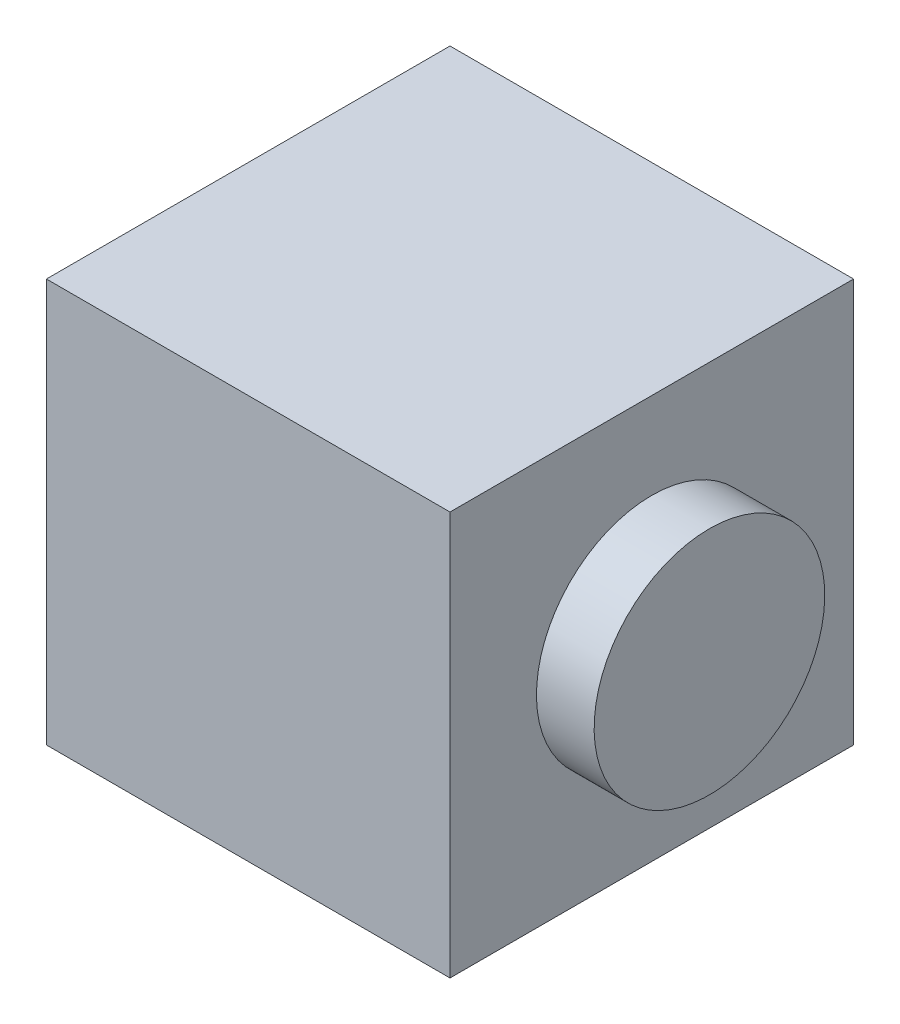
ISO-10303-21;
HEADER;
FILE_DESCRIPTION(('STEP AP214'),'2;1');
FILE_NAME('part.step','',(''),(''),'','','');
FILE_SCHEMA(('AUTOMOTIVE_DESIGN { 1 0 10303 214 1 1 1 1 }'));
ENDSEC;
DATA;
#1=APPLICATION_CONTEXT('core data for automotive mechanical design processes');
#2=APPLICATION_PROTOCOL_DEFINITION('international standard','automotive_design',2000,#1);
#3=PRODUCT_CONTEXT('',#1,'mechanical');
#4=PRODUCT('Part','Part','',(#3));
#5=PRODUCT_RELATED_PRODUCT_CATEGORY('part','',(#4));
#6=PRODUCT_DEFINITION_FORMATION('','',#4);
#7=PRODUCT_DEFINITION_CONTEXT('part definition',#1,'design');
#8=PRODUCT_DEFINITION('design','',#6,#7);
#9=PRODUCT_DEFINITION_SHAPE('','',#8);
#10=(LENGTH_UNIT() NAMED_UNIT(*) SI_UNIT(.MILLI.,.METRE.));
#11=(NAMED_UNIT(*) PLANE_ANGLE_UNIT() SI_UNIT($,.RADIAN.));
#12=(NAMED_UNIT(*) SI_UNIT($,.STERADIAN.) SOLID_ANGLE_UNIT());
#13=UNCERTAINTY_MEASURE_WITH_UNIT(LENGTH_MEASURE(1.E-05),#10,'distance_accuracy_value','');
#14=(GEOMETRIC_REPRESENTATION_CONTEXT(3) GLOBAL_UNCERTAINTY_ASSIGNED_CONTEXT((#13)) GLOBAL_UNIT_ASSIGNED_CONTEXT((#10,
#11,#12)) REPRESENTATION_CONTEXT('',''));
#15=CARTESIAN_POINT('',(0.,0.,0.));
#16=DIRECTION('',(0.,0.,1.));
#17=DIRECTION('',(1.,0.,0.));
#18=AXIS2_PLACEMENT_3D('',#15,#16,#17);
#19=CARTESIAN_POINT('',(0.,0.,70.));
#20=DIRECTION('',(1.,0.,0.));
#21=DIRECTION('',(0.,0.,-1.));
#22=AXIS2_PLACEMENT_3D('',#19,#20,#21);
#23=PLANE('',#22);
#24=DIRECTION('',(0.,-1.,0.));
#25=VECTOR('',#24,1.);
#26=CARTESIAN_POINT('',(0.,0.,0.));
#27=LINE('',#26,#25);
#28=CARTESIAN_POINT('',(0.,70.,0.));
#29=VERTEX_POINT('',#28);
#30=CARTESIAN_POINT('',(0.,0.,0.));
#31=VERTEX_POINT('',#30);
#32=EDGE_CURVE('E110',#29,#31,#27,.T.);
#33=ORIENTED_EDGE('',*,*,#32,.T.);
#34=DIRECTION('',(0.,0.,-1.));
#35=VECTOR('',#34,1.);
#36=CARTESIAN_POINT('',(0.,0.,70.));
#37=LINE('',#36,#35);
#38=CARTESIAN_POINT('',(0.,0.,70.));
#39=VERTEX_POINT('',#38);
#40=EDGE_CURVE('E42',#39,#31,#37,.T.);
#41=ORIENTED_EDGE('',*,*,#40,.F.);
#42=DIRECTION('',(0.,-1.,0.));
#43=VECTOR('',#42,1.);
#44=CARTESIAN_POINT('',(0.,0.,70.));
#45=LINE('',#44,#43);
#46=CARTESIAN_POINT('',(0.,70.,70.));
#47=VERTEX_POINT('',#46);
#48=EDGE_CURVE('E93',#47,#39,#45,.T.);
#49=ORIENTED_EDGE('',*,*,#48,.F.);
#50=DIRECTION('',(0.,0.,-1.));
#51=VECTOR('',#50,1.);
#52=CARTESIAN_POINT('',(0.,70.,70.));
#53=LINE('',#52,#51);
#54=EDGE_CURVE('E106',#47,#29,#53,.T.);
#55=ORIENTED_EDGE('',*,*,#54,.T.);
#56=EDGE_LOOP('',(#33,#41,#49,#55));
#57=FACE_BOUND('',#56,.T.);
#58=ADVANCED_FACE('F39',(#57),#23,.F.);
#59=CARTESIAN_POINT('',(0.,0.,70.));
#60=DIRECTION('',(0.,1.,0.));
#61=DIRECTION('',(0.,0.,1.));
#62=AXIS2_PLACEMENT_3D('',#59,#60,#61);
#63=PLANE('',#62);
#64=DIRECTION('',(1.,0.,0.));
#65=VECTOR('',#64,1.);
#66=CARTESIAN_POINT('',(0.,0.,0.));
#67=LINE('',#66,#65);
#68=CARTESIAN_POINT('',(70.,0.,0.));
#69=VERTEX_POINT('',#68);
#70=EDGE_CURVE('E99',#31,#69,#67,.T.);
#71=ORIENTED_EDGE('',*,*,#70,.T.);
#72=DIRECTION('',(0.,0.,-1.));
#73=VECTOR('',#72,1.);
#74=CARTESIAN_POINT('',(70.,0.,70.));
#75=LINE('',#74,#73);
#76=CARTESIAN_POINT('',(70.,0.,70.));
#77=VERTEX_POINT('',#76);
#78=EDGE_CURVE('E97',#77,#69,#75,.T.);
#79=ORIENTED_EDGE('',*,*,#78,.F.);
#80=DIRECTION('',(1.,0.,0.));
#81=VECTOR('',#80,1.);
#82=CARTESIAN_POINT('',(0.,0.,70.));
#83=LINE('',#82,#81);
#84=EDGE_CURVE('E88',#39,#77,#83,.T.);
#85=ORIENTED_EDGE('',*,*,#84,.F.);
#86=ORIENTED_EDGE('',*,*,#40,.T.);
#87=EDGE_LOOP('',(#71,#79,#85,#86));
#88=FACE_BOUND('',#87,.T.);
#89=ADVANCED_FACE('F98',(#88),#63,.F.);
#90=CARTESIAN_POINT('',(70.,0.,70.));
#91=DIRECTION('',(-1.,0.,0.));
#92=DIRECTION('',(0.,-1.,0.));
#93=AXIS2_PLACEMENT_3D('',#90,#91,#92);
#94=PLANE('',#93);
#95=CARTESIAN_POINT('',(70.,35.,35.));
#96=DIRECTION('',(1.,0.,0.));
#97=DIRECTION('',(0.,1.,0.));
#98=AXIS2_PLACEMENT_3D('',#95,#96,#97);
#99=CIRCLE('',#98,20.);
#100=CARTESIAN_POINT('',(70.,55.,35.));
#101=VERTEX_POINT('',#100);
#102=EDGE_CURVE('E11',#101,#101,#99,.T.);
#103=ORIENTED_EDGE('',*,*,#102,.F.);
#104=EDGE_LOOP('',(#103));
#105=FACE_BOUND('',#104,.T.);
#106=DIRECTION('',(0.,1.,0.));
#107=VECTOR('',#106,1.);
#108=CARTESIAN_POINT('',(70.,0.,0.));
#109=LINE('',#108,#107);
#110=CARTESIAN_POINT('',(70.,70.,0.));
#111=VERTEX_POINT('',#110);
#112=EDGE_CURVE('E74',#69,#111,#109,.T.);
#113=ORIENTED_EDGE('',*,*,#112,.T.);
#114=DIRECTION('',(0.,0.,-1.));
#115=VECTOR('',#114,1.);
#116=CARTESIAN_POINT('',(70.,70.,70.));
#117=LINE('',#116,#115);
#118=CARTESIAN_POINT('',(70.,70.,70.));
#119=VERTEX_POINT('',#118);
#120=EDGE_CURVE('E101',#119,#111,#117,.T.);
#121=ORIENTED_EDGE('',*,*,#120,.F.);
#122=DIRECTION('',(0.,1.,0.));
#123=VECTOR('',#122,1.);
#124=CARTESIAN_POINT('',(70.,0.,70.));
#125=LINE('',#124,#123);
#126=EDGE_CURVE('E91',#77,#119,#125,.T.);
#127=ORIENTED_EDGE('',*,*,#126,.F.);
#128=ORIENTED_EDGE('',*,*,#78,.T.);
#129=EDGE_LOOP('',(#113,#121,#127,#128));
#130=FACE_BOUND('',#129,.T.);
#131=ADVANCED_FACE('F102',(#105,#130),#94,.F.);
#132=CARTESIAN_POINT('',(0.,70.,70.));
#133=DIRECTION('',(0.,-1.,0.));
#134=DIRECTION('',(0.,0.,-1.));
#135=AXIS2_PLACEMENT_3D('',#132,#133,#134);
#136=PLANE('',#135);
#137=DIRECTION('',(-1.,0.,0.));
#138=VECTOR('',#137,1.);
#139=CARTESIAN_POINT('',(0.,70.,0.));
#140=LINE('',#139,#138);
#141=EDGE_CURVE('E80',#111,#29,#140,.T.);
#142=ORIENTED_EDGE('',*,*,#141,.T.);
#143=ORIENTED_EDGE('',*,*,#54,.F.);
#144=DIRECTION('',(-1.,0.,0.));
#145=VECTOR('',#144,1.);
#146=CARTESIAN_POINT('',(0.,70.,70.));
#147=LINE('',#146,#145);
#148=EDGE_CURVE('E57',#119,#47,#147,.T.);
#149=ORIENTED_EDGE('',*,*,#148,.F.);
#150=ORIENTED_EDGE('',*,*,#120,.T.);
#151=EDGE_LOOP('',(#142,#143,#149,#150));
#152=FACE_BOUND('',#151,.T.);
#153=ADVANCED_FACE('F124',(#152),#136,.F.);
#154=CARTESIAN_POINT('',(0.,0.,70.));
#155=DIRECTION('',(0.,0.,-1.));
#156=DIRECTION('',(-1.,0.,0.));
#157=AXIS2_PLACEMENT_3D('',#154,#155,#156);
#158=PLANE('',#157);
#159=ORIENTED_EDGE('',*,*,#48,.T.);
#160=ORIENTED_EDGE('',*,*,#84,.T.);
#161=ORIENTED_EDGE('',*,*,#126,.T.);
#162=ORIENTED_EDGE('',*,*,#148,.T.);
#163=EDGE_LOOP('',(#159,#160,#161,#162));
#164=FACE_BOUND('',#163,.T.);
#165=ADVANCED_FACE('F89',(#164),#158,.F.);
#166=CARTESIAN_POINT('',(0.,0.,0.));
#167=DIRECTION('',(0.,0.,-1.));
#168=DIRECTION('',(-1.,0.,0.));
#169=AXIS2_PLACEMENT_3D('',#166,#167,#168);
#170=PLANE('',#169);
#171=CARTESIAN_POINT('',(35.,35.,0.));
#172=DIRECTION('',(0.,0.,-1.));
#173=DIRECTION('',(-1.,0.,0.));
#174=AXIS2_PLACEMENT_3D('',#171,#172,#173);
#175=CIRCLE('',#174,20.);
#176=CARTESIAN_POINT('',(15.,35.,0.));
#177=VERTEX_POINT('',#176);
#178=EDGE_CURVE('E135',#177,#177,#175,.T.);
#179=ORIENTED_EDGE('',*,*,#178,.F.);
#180=EDGE_LOOP('',(#179));
#181=FACE_BOUND('',#180,.T.);
#182=ORIENTED_EDGE('',*,*,#32,.F.);
#183=ORIENTED_EDGE('',*,*,#141,.F.);
#184=ORIENTED_EDGE('',*,*,#112,.F.);
#185=ORIENTED_EDGE('',*,*,#70,.F.);
#186=EDGE_LOOP('',(#182,#183,#184,#185));
#187=FACE_BOUND('',#186,.T.);
#188=ADVANCED_FACE('F127',(#181,#187),#170,.T.);
#189=CARTESIAN_POINT('',(80.,35.,35.));
#190=DIRECTION('',(-1.,0.,0.));
#191=DIRECTION('',(0.,-1.,0.));
#192=AXIS2_PLACEMENT_3D('',#189,#190,#191);
#193=CYLINDRICAL_SURFACE('',#192,20.);
#194=CARTESIAN_POINT('',(80.,35.,35.));
#195=DIRECTION('',(1.,0.,0.));
#196=DIRECTION('',(0.,1.,0.));
#197=AXIS2_PLACEMENT_3D('',#194,#195,#196);
#198=CIRCLE('',#197,20.);
#199=CARTESIAN_POINT('',(80.,55.,35.));
#200=VERTEX_POINT('',#199);
#201=EDGE_CURVE('E114',#200,#200,#198,.T.);
#202=ORIENTED_EDGE('',*,*,#201,.F.);
#203=EDGE_LOOP('',(#202));
#204=FACE_BOUND('',#203,.T.);
#205=ORIENTED_EDGE('',*,*,#102,.T.);
#206=EDGE_LOOP('',(#205));
#207=FACE_BOUND('',#206,.T.);
#208=ADVANCED_FACE('F153',(#204,#207),#193,.T.);
#209=CARTESIAN_POINT('',(80.,35.,35.));
#210=DIRECTION('',(1.,0.,0.));
#211=DIRECTION('',(0.,1.,0.));
#212=AXIS2_PLACEMENT_3D('',#209,#210,#211);
#213=PLANE('',#212);
#214=ORIENTED_EDGE('',*,*,#201,.T.);
#215=EDGE_LOOP('',(#214));
#216=FACE_BOUND('',#215,.T.);
#217=ADVANCED_FACE('F148',(#216),#213,.T.);
#218=CARTESIAN_POINT('',(35.,35.,10.));
#219=DIRECTION('',(0.,0.,-1.));
#220=DIRECTION('',(-1.,0.,0.));
#221=AXIS2_PLACEMENT_3D('',#218,#219,#220);
#222=CYLINDRICAL_SURFACE('',#221,20.);
#223=CARTESIAN_POINT('',(35.,35.,10.));
#224=DIRECTION('',(0.,0.,-1.));
#225=DIRECTION('',(-1.,0.,0.));
#226=AXIS2_PLACEMENT_3D('',#223,#224,#225);
#227=CIRCLE('',#226,20.);
#228=CARTESIAN_POINT('',(15.,35.,10.));
#229=VERTEX_POINT('',#228);
#230=EDGE_CURVE('E134',#229,#229,#227,.T.);
#231=ORIENTED_EDGE('',*,*,#230,.F.);
#232=EDGE_LOOP('',(#231));
#233=FACE_BOUND('',#232,.T.);
#234=ORIENTED_EDGE('',*,*,#178,.T.);
#235=EDGE_LOOP('',(#234));
#236=FACE_BOUND('',#235,.T.);
#237=ADVANCED_FACE('F145',(#233,#236),#222,.F.);
#238=CARTESIAN_POINT('',(35.,35.,10.));
#239=DIRECTION('',(0.,0.,-1.));
#240=DIRECTION('',(-1.,0.,0.));
#241=AXIS2_PLACEMENT_3D('',#238,#239,#240);
#242=PLANE('',#241);
#243=ORIENTED_EDGE('',*,*,#230,.T.);
#244=EDGE_LOOP('',(#243));
#245=FACE_BOUND('',#244,.T.);
#246=ADVANCED_FACE('F143',(#245),#242,.T.);
#247=CLOSED_SHELL('',(#58,#89,#131,#153,#165,#188,#208,#217,#237,#246));
#248=MANIFOLD_SOLID_BREP('B2',#247);
#249=ADVANCED_BREP_SHAPE_REPRESENTATION('',(#18,#248),#14);
#250=SHAPE_DEFINITION_REPRESENTATION(#9,#249);
ENDSEC;
END-ISO-10303-21;
